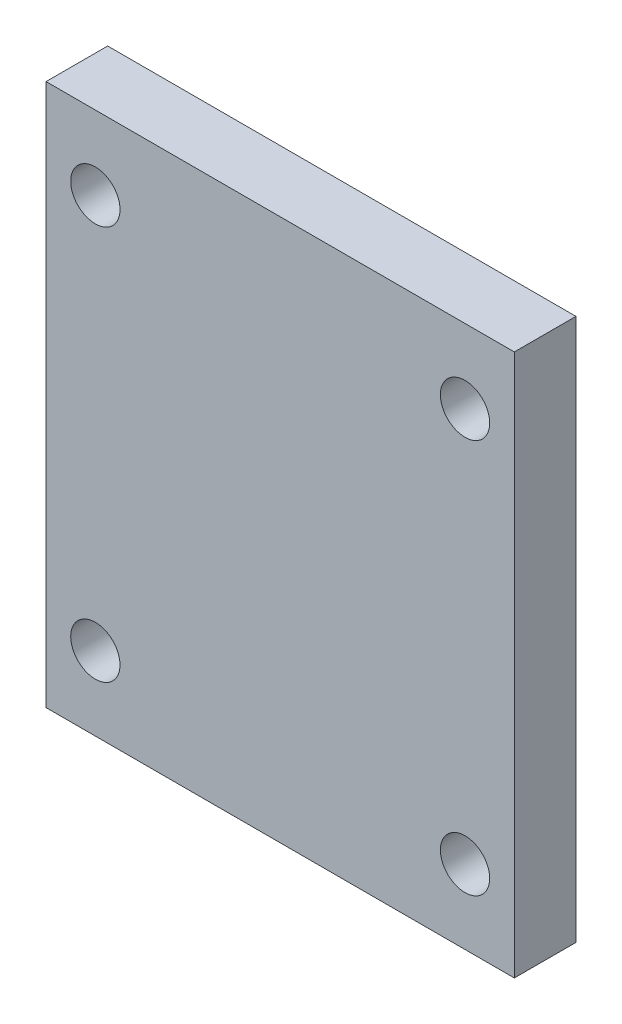
ISO-10303-21;
HEADER;
FILE_DESCRIPTION(('STEP AP214'),'2;1');
FILE_NAME('part.step','',(''),(''),'','','');
FILE_SCHEMA(('AUTOMOTIVE_DESIGN { 1 0 10303 214 1 1 1 1 }'));
ENDSEC;
DATA;
#1=APPLICATION_CONTEXT('core data for automotive mechanical design processes');
#2=APPLICATION_PROTOCOL_DEFINITION('international standard','automotive_design',2000,#1);
#3=PRODUCT_CONTEXT('',#1,'mechanical');
#4=PRODUCT('Part','Part','',(#3));
#5=PRODUCT_RELATED_PRODUCT_CATEGORY('part','',(#4));
#6=PRODUCT_DEFINITION_FORMATION('','',#4);
#7=PRODUCT_DEFINITION_CONTEXT('part definition',#1,'design');
#8=PRODUCT_DEFINITION('design','',#6,#7);
#9=PRODUCT_DEFINITION_SHAPE('','',#8);
#10=(LENGTH_UNIT() NAMED_UNIT(*) SI_UNIT(.MILLI.,.METRE.));
#11=(NAMED_UNIT(*) PLANE_ANGLE_UNIT() SI_UNIT($,.RADIAN.));
#12=(NAMED_UNIT(*) SI_UNIT($,.STERADIAN.) SOLID_ANGLE_UNIT());
#13=UNCERTAINTY_MEASURE_WITH_UNIT(LENGTH_MEASURE(1.E-05),#10,'distance_accuracy_value','');
#14=(GEOMETRIC_REPRESENTATION_CONTEXT(3) GLOBAL_UNCERTAINTY_ASSIGNED_CONTEXT((#13)) GLOBAL_UNIT_ASSIGNED_CONTEXT((#10,
#11,#12)) REPRESENTATION_CONTEXT('',''));
#15=CARTESIAN_POINT('',(0.,0.,0.));
#16=DIRECTION('',(0.,0.,1.));
#17=DIRECTION('',(1.,0.,0.));
#18=AXIS2_PLACEMENT_3D('',#15,#16,#17);
#19=CARTESIAN_POINT('',(0.,0.,2.5));
#20=DIRECTION('',(0.,0.,-1.));
#21=DIRECTION('',(-1.,0.,0.));
#22=AXIS2_PLACEMENT_3D('',#19,#20,#21);
#23=PLANE('',#22);
#24=DIRECTION('',(0.,1.,0.));
#25=VECTOR('',#24,1.);
#26=CARTESIAN_POINT('',(19.,-22.,2.5));
#27=LINE('',#26,#25);
#28=CARTESIAN_POINT('',(19.,-22.,2.5));
#29=VERTEX_POINT('',#28);
#30=CARTESIAN_POINT('',(19.,22.,2.5));
#31=VERTEX_POINT('',#30);
#32=EDGE_CURVE('E91',#29,#31,#27,.T.);
#33=ORIENTED_EDGE('',*,*,#32,.T.);
#34=DIRECTION('',(-1.,0.,0.));
#35=VECTOR('',#34,1.);
#36=CARTESIAN_POINT('',(-19.,22.,2.5));
#37=LINE('',#36,#35);
#38=CARTESIAN_POINT('',(-19.,22.,2.5));
#39=VERTEX_POINT('',#38);
#40=EDGE_CURVE('E86',#31,#39,#37,.T.);
#41=ORIENTED_EDGE('',*,*,#40,.T.);
#42=DIRECTION('',(0.,-1.,0.));
#43=VECTOR('',#42,1.);
#44=CARTESIAN_POINT('',(-19.,-22.,2.5));
#45=LINE('',#44,#43);
#46=CARTESIAN_POINT('',(-19.,-22.,2.5));
#47=VERTEX_POINT('',#46);
#48=EDGE_CURVE('E87',#39,#47,#45,.T.);
#49=ORIENTED_EDGE('',*,*,#48,.T.);
#50=DIRECTION('',(1.,0.,0.));
#51=VECTOR('',#50,1.);
#52=CARTESIAN_POINT('',(-19.,-22.,2.5));
#53=LINE('',#52,#51);
#54=EDGE_CURVE('E57',#47,#29,#53,.T.);
#55=ORIENTED_EDGE('',*,*,#54,.T.);
#56=EDGE_LOOP('',(#33,#41,#49,#55));
#57=FACE_BOUND('',#56,.T.);
#58=CARTESIAN_POINT('',(-15.,16.,2.5));
#59=DIRECTION('',(0.,0.,1.));
#60=DIRECTION('',(1.,0.,0.));
#61=AXIS2_PLACEMENT_3D('',#58,#59,#60);
#62=CIRCLE('',#61,2.);
#63=CARTESIAN_POINT('',(-13.,16.,2.5));
#64=VERTEX_POINT('',#63);
#65=EDGE_CURVE('E106',#64,#64,#62,.T.);
#66=ORIENTED_EDGE('',*,*,#65,.F.);
#67=EDGE_LOOP('',(#66));
#68=FACE_BOUND('',#67,.T.);
#69=CARTESIAN_POINT('',(-15.,-16.,2.5));
#70=DIRECTION('',(0.,0.,1.));
#71=DIRECTION('',(-1.,0.,0.));
#72=AXIS2_PLACEMENT_3D('',#69,#70,#71);
#73=CIRCLE('',#72,2.);
#74=CARTESIAN_POINT('',(-17.,-16.,2.5));
#75=VERTEX_POINT('',#74);
#76=EDGE_CURVE('E123',#75,#75,#73,.T.);
#77=ORIENTED_EDGE('',*,*,#76,.F.);
#78=EDGE_LOOP('',(#77));
#79=FACE_BOUND('',#78,.T.);
#80=CARTESIAN_POINT('',(15.,-16.,2.5));
#81=DIRECTION('',(0.,0.,1.));
#82=DIRECTION('',(1.,0.,0.));
#83=AXIS2_PLACEMENT_3D('',#80,#81,#82);
#84=CIRCLE('',#83,2.);
#85=CARTESIAN_POINT('',(17.,-16.,2.5));
#86=VERTEX_POINT('',#85);
#87=EDGE_CURVE('E130',#86,#86,#84,.T.);
#88=ORIENTED_EDGE('',*,*,#87,.F.);
#89=EDGE_LOOP('',(#88));
#90=FACE_BOUND('',#89,.T.);
#91=CARTESIAN_POINT('',(15.,16.,2.5));
#92=DIRECTION('',(0.,0.,1.));
#93=DIRECTION('',(-1.,0.,0.));
#94=AXIS2_PLACEMENT_3D('',#91,#92,#93);
#95=CIRCLE('',#94,2.);
#96=CARTESIAN_POINT('',(13.,16.,2.5));
#97=VERTEX_POINT('',#96);
#98=EDGE_CURVE('E133',#97,#97,#95,.T.);
#99=ORIENTED_EDGE('',*,*,#98,.F.);
#100=EDGE_LOOP('',(#99));
#101=FACE_BOUND('',#100,.T.);
#102=ADVANCED_FACE('F39',(#57,#68,#79,#90,#101),#23,.F.);
#103=CARTESIAN_POINT('',(0.,0.,-2.5));
#104=DIRECTION('',(0.,0.,-1.));
#105=DIRECTION('',(-1.,0.,0.));
#106=AXIS2_PLACEMENT_3D('',#103,#104,#105);
#107=PLANE('',#106);
#108=CARTESIAN_POINT('',(15.,-16.,-2.5));
#109=DIRECTION('',(0.,0.,1.));
#110=DIRECTION('',(1.,0.,0.));
#111=AXIS2_PLACEMENT_3D('',#108,#109,#110);
#112=CIRCLE('',#111,2.);
#113=CARTESIAN_POINT('',(17.,-16.,-2.5));
#114=VERTEX_POINT('',#113);
#115=EDGE_CURVE('E127',#114,#114,#112,.T.);
#116=ORIENTED_EDGE('',*,*,#115,.T.);
#117=EDGE_LOOP('',(#116));
#118=FACE_BOUND('',#117,.T.);
#119=CARTESIAN_POINT('',(-15.,16.,-2.5));
#120=DIRECTION('',(0.,0.,1.));
#121=DIRECTION('',(1.,0.,0.));
#122=AXIS2_PLACEMENT_3D('',#119,#120,#121);
#123=CIRCLE('',#122,2.);
#124=CARTESIAN_POINT('',(-13.,16.,-2.5));
#125=VERTEX_POINT('',#124);
#126=EDGE_CURVE('E119',#125,#125,#123,.T.);
#127=ORIENTED_EDGE('',*,*,#126,.T.);
#128=EDGE_LOOP('',(#127));
#129=FACE_BOUND('',#128,.T.);
#130=DIRECTION('',(0.,1.,0.));
#131=VECTOR('',#130,1.);
#132=CARTESIAN_POINT('',(19.,-22.,-2.5));
#133=LINE('',#132,#131);
#134=CARTESIAN_POINT('',(19.,-22.,-2.5));
#135=VERTEX_POINT('',#134);
#136=CARTESIAN_POINT('',(19.,22.,-2.5));
#137=VERTEX_POINT('',#136);
#138=EDGE_CURVE('E104',#135,#137,#133,.T.);
#139=ORIENTED_EDGE('',*,*,#138,.F.);
#140=DIRECTION('',(1.,0.,0.));
#141=VECTOR('',#140,1.);
#142=CARTESIAN_POINT('',(-19.,-22.,-2.5));
#143=LINE('',#142,#141);
#144=CARTESIAN_POINT('',(-19.,-22.,-2.5));
#145=VERTEX_POINT('',#144);
#146=EDGE_CURVE('E80',#145,#135,#143,.T.);
#147=ORIENTED_EDGE('',*,*,#146,.F.);
#148=DIRECTION('',(0.,-1.,0.));
#149=VECTOR('',#148,1.);
#150=CARTESIAN_POINT('',(-19.,-22.,-2.5));
#151=LINE('',#150,#149);
#152=CARTESIAN_POINT('',(-19.,22.,-2.5));
#153=VERTEX_POINT('',#152);
#154=EDGE_CURVE('E74',#153,#145,#151,.T.);
#155=ORIENTED_EDGE('',*,*,#154,.F.);
#156=DIRECTION('',(-1.,0.,0.));
#157=VECTOR('',#156,1.);
#158=CARTESIAN_POINT('',(-19.,22.,-2.5));
#159=LINE('',#158,#157);
#160=EDGE_CURVE('E94',#137,#153,#159,.T.);
#161=ORIENTED_EDGE('',*,*,#160,.F.);
#162=EDGE_LOOP('',(#139,#147,#155,#161));
#163=FACE_BOUND('',#162,.T.);
#164=CARTESIAN_POINT('',(-15.,-16.,-2.5));
#165=DIRECTION('',(0.,0.,1.));
#166=DIRECTION('',(-1.,0.,0.));
#167=AXIS2_PLACEMENT_3D('',#164,#165,#166);
#168=CIRCLE('',#167,2.);
#169=CARTESIAN_POINT('',(-17.,-16.,-2.5));
#170=VERTEX_POINT('',#169);
#171=EDGE_CURVE('E125',#170,#170,#168,.T.);
#172=ORIENTED_EDGE('',*,*,#171,.T.);
#173=EDGE_LOOP('',(#172));
#174=FACE_BOUND('',#173,.T.);
#175=CARTESIAN_POINT('',(15.,16.,-2.5));
#176=DIRECTION('',(0.,0.,1.));
#177=DIRECTION('',(-1.,0.,0.));
#178=AXIS2_PLACEMENT_3D('',#175,#176,#177);
#179=CIRCLE('',#178,2.);
#180=CARTESIAN_POINT('',(13.,16.,-2.5));
#181=VERTEX_POINT('',#180);
#182=EDGE_CURVE('E136',#181,#181,#179,.T.);
#183=ORIENTED_EDGE('',*,*,#182,.T.);
#184=EDGE_LOOP('',(#183));
#185=FACE_BOUND('',#184,.T.);
#186=ADVANCED_FACE('F114',(#118,#129,#163,#174,#185),#107,.T.);
#187=CARTESIAN_POINT('',(19.,-22.,2.5));
#188=DIRECTION('',(-1.,0.,0.));
#189=DIRECTION('',(0.,0.,1.));
#190=AXIS2_PLACEMENT_3D('',#187,#188,#189);
#191=PLANE('',#190);
#192=ORIENTED_EDGE('',*,*,#138,.T.);
#193=DIRECTION('',(0.,0.,-1.));
#194=VECTOR('',#193,1.);
#195=CARTESIAN_POINT('',(19.,22.,2.5));
#196=LINE('',#195,#194);
#197=EDGE_CURVE('E11',#31,#137,#196,.T.);
#198=ORIENTED_EDGE('',*,*,#197,.F.);
#199=ORIENTED_EDGE('',*,*,#32,.F.);
#200=DIRECTION('',(0.,0.,-1.));
#201=VECTOR('',#200,1.);
#202=CARTESIAN_POINT('',(19.,-22.,2.5));
#203=LINE('',#202,#201);
#204=EDGE_CURVE('E98',#29,#135,#203,.T.);
#205=ORIENTED_EDGE('',*,*,#204,.T.);
#206=EDGE_LOOP('',(#192,#198,#199,#205));
#207=FACE_BOUND('',#206,.T.);
#208=ADVANCED_FACE('F41',(#207),#191,.F.);
#209=CARTESIAN_POINT('',(-19.,22.,2.5));
#210=DIRECTION('',(0.,-1.,0.));
#211=DIRECTION('',(0.,0.,-1.));
#212=AXIS2_PLACEMENT_3D('',#209,#210,#211);
#213=PLANE('',#212);
#214=ORIENTED_EDGE('',*,*,#160,.T.);
#215=DIRECTION('',(0.,0.,-1.));
#216=VECTOR('',#215,1.);
#217=CARTESIAN_POINT('',(-19.,22.,2.5));
#218=LINE('',#217,#216);
#219=EDGE_CURVE('E48',#39,#153,#218,.T.);
#220=ORIENTED_EDGE('',*,*,#219,.F.);
#221=ORIENTED_EDGE('',*,*,#40,.F.);
#222=ORIENTED_EDGE('',*,*,#197,.T.);
#223=EDGE_LOOP('',(#214,#220,#221,#222));
#224=FACE_BOUND('',#223,.T.);
#225=ADVANCED_FACE('F92',(#224),#213,.F.);
#226=CARTESIAN_POINT('',(-19.,-22.,2.5));
#227=DIRECTION('',(1.,0.,0.));
#228=DIRECTION('',(0.,0.,-1.));
#229=AXIS2_PLACEMENT_3D('',#226,#227,#228);
#230=PLANE('',#229);
#231=ORIENTED_EDGE('',*,*,#154,.T.);
#232=DIRECTION('',(0.,0.,-1.));
#233=VECTOR('',#232,1.);
#234=CARTESIAN_POINT('',(-19.,-22.,2.5));
#235=LINE('',#234,#233);
#236=EDGE_CURVE('E96',#47,#145,#235,.T.);
#237=ORIENTED_EDGE('',*,*,#236,.F.);
#238=ORIENTED_EDGE('',*,*,#48,.F.);
#239=ORIENTED_EDGE('',*,*,#219,.T.);
#240=EDGE_LOOP('',(#231,#237,#238,#239));
#241=FACE_BOUND('',#240,.T.);
#242=ADVANCED_FACE('F100',(#241),#230,.F.);
#243=CARTESIAN_POINT('',(-19.,-22.,2.5));
#244=DIRECTION('',(0.,1.,0.));
#245=DIRECTION('',(0.,0.,1.));
#246=AXIS2_PLACEMENT_3D('',#243,#244,#245);
#247=PLANE('',#246);
#248=ORIENTED_EDGE('',*,*,#146,.T.);
#249=ORIENTED_EDGE('',*,*,#204,.F.);
#250=ORIENTED_EDGE('',*,*,#54,.F.);
#251=ORIENTED_EDGE('',*,*,#236,.T.);
#252=EDGE_LOOP('',(#248,#249,#250,#251));
#253=FACE_BOUND('',#252,.T.);
#254=ADVANCED_FACE('F112',(#253),#247,.F.);
#255=CARTESIAN_POINT('',(-15.,16.,2.5));
#256=DIRECTION('',(0.,0.,-1.));
#257=DIRECTION('',(-1.,0.,0.));
#258=AXIS2_PLACEMENT_3D('',#255,#256,#257);
#259=CYLINDRICAL_SURFACE('',#258,2.);
#260=ORIENTED_EDGE('',*,*,#65,.T.);
#261=EDGE_LOOP('',(#260));
#262=FACE_BOUND('',#261,.T.);
#263=ORIENTED_EDGE('',*,*,#126,.F.);
#264=EDGE_LOOP('',(#263));
#265=FACE_BOUND('',#264,.T.);
#266=ADVANCED_FACE('F154',(#262,#265),#259,.F.);
#267=CARTESIAN_POINT('',(-15.,-16.,2.5));
#268=DIRECTION('',(0.,0.,-1.));
#269=DIRECTION('',(-1.,0.,0.));
#270=AXIS2_PLACEMENT_3D('',#267,#268,#269);
#271=CYLINDRICAL_SURFACE('',#270,2.);
#272=ORIENTED_EDGE('',*,*,#76,.T.);
#273=EDGE_LOOP('',(#272));
#274=FACE_BOUND('',#273,.T.);
#275=ORIENTED_EDGE('',*,*,#171,.F.);
#276=EDGE_LOOP('',(#275));
#277=FACE_BOUND('',#276,.T.);
#278=ADVANCED_FACE('F199',(#274,#277),#271,.F.);
#279=CARTESIAN_POINT('',(15.,-16.,2.5));
#280=DIRECTION('',(0.,0.,-1.));
#281=DIRECTION('',(-1.,0.,0.));
#282=AXIS2_PLACEMENT_3D('',#279,#280,#281);
#283=CYLINDRICAL_SURFACE('',#282,2.);
#284=ORIENTED_EDGE('',*,*,#87,.T.);
#285=EDGE_LOOP('',(#284));
#286=FACE_BOUND('',#285,.T.);
#287=ORIENTED_EDGE('',*,*,#115,.F.);
#288=EDGE_LOOP('',(#287));
#289=FACE_BOUND('',#288,.T.);
#290=ADVANCED_FACE('F206',(#286,#289),#283,.F.);
#291=CARTESIAN_POINT('',(15.,16.,2.5));
#292=DIRECTION('',(0.,0.,-1.));
#293=DIRECTION('',(-1.,0.,0.));
#294=AXIS2_PLACEMENT_3D('',#291,#292,#293);
#295=CYLINDRICAL_SURFACE('',#294,2.);
#296=ORIENTED_EDGE('',*,*,#98,.T.);
#297=EDGE_LOOP('',(#296));
#298=FACE_BOUND('',#297,.T.);
#299=ORIENTED_EDGE('',*,*,#182,.F.);
#300=EDGE_LOOP('',(#299));
#301=FACE_BOUND('',#300,.T.);
#302=ADVANCED_FACE('F145',(#298,#301),#295,.F.);
#303=CLOSED_SHELL('',(#102,#186,#208,#225,#242,#254,#266,#278,#290,#302));
#304=MANIFOLD_SOLID_BREP('B2',#303);
#305=ADVANCED_BREP_SHAPE_REPRESENTATION('',(#18,#304),#14);
#306=SHAPE_DEFINITION_REPRESENTATION(#9,#305);
ENDSEC;
END-ISO-10303-21;
